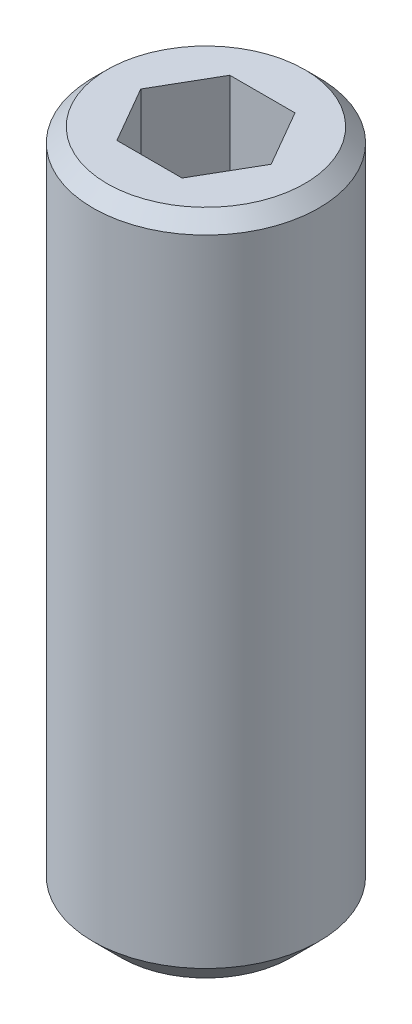
ISO-10303-21;
HEADER;
FILE_DESCRIPTION(('STEP AP214'),'2;1');
FILE_NAME('part.step','',(''),(''),'','','');
FILE_SCHEMA(('AUTOMOTIVE_DESIGN { 1 0 10303 214 1 1 1 1 }'));
ENDSEC;
DATA;
#1=APPLICATION_CONTEXT('core data for automotive mechanical design processes');
#2=APPLICATION_PROTOCOL_DEFINITION('international standard','automotive_design',2000,#1);
#3=PRODUCT_CONTEXT('',#1,'mechanical');
#4=PRODUCT('Part','Part','',(#3));
#5=PRODUCT_RELATED_PRODUCT_CATEGORY('part','',(#4));
#6=PRODUCT_DEFINITION_FORMATION('','',#4);
#7=PRODUCT_DEFINITION_CONTEXT('part definition',#1,'design');
#8=PRODUCT_DEFINITION('design','',#6,#7);
#9=PRODUCT_DEFINITION_SHAPE('','',#8);
#10=(LENGTH_UNIT() NAMED_UNIT(*) SI_UNIT(.MILLI.,.METRE.));
#11=(NAMED_UNIT(*) PLANE_ANGLE_UNIT() SI_UNIT($,.RADIAN.));
#12=(NAMED_UNIT(*) SI_UNIT($,.STERADIAN.) SOLID_ANGLE_UNIT());
#13=UNCERTAINTY_MEASURE_WITH_UNIT(LENGTH_MEASURE(1.E-05),#10,'distance_accuracy_value','');
#14=(GEOMETRIC_REPRESENTATION_CONTEXT(3) GLOBAL_UNCERTAINTY_ASSIGNED_CONTEXT((#13)) GLOBAL_UNIT_ASSIGNED_CONTEXT((#10,
#11,#12)) REPRESENTATION_CONTEXT('',''));
#15=CARTESIAN_POINT('',(0.,0.,0.));
#16=DIRECTION('',(0.,0.,1.));
#17=DIRECTION('',(1.,0.,0.));
#18=AXIS2_PLACEMENT_3D('',#15,#16,#17);
#19=CARTESIAN_POINT('',(0.,12.,0.));
#20=DIRECTION('',(0.,-1.,0.));
#21=DIRECTION('',(0.,0.,-1.));
#22=AXIS2_PLACEMENT_3D('',#19,#20,#21);
#23=CYLINDRICAL_SURFACE('',#22,2.);
#24=CARTESIAN_POINT('',(0.,0.500000000000002,0.));
#25=DIRECTION('',(0.,1.,0.));
#26=DIRECTION('',(0.,0.,1.));
#27=AXIS2_PLACEMENT_3D('',#24,#25,#26);
#28=CIRCLE('',#27,2.);
#29=CARTESIAN_POINT('',(0.,0.500000000000002,2.));
#30=VERTEX_POINT('',#29);
#31=EDGE_CURVE('E48',#30,#30,#28,.T.);
#32=ORIENTED_EDGE('',*,*,#31,.T.);
#33=EDGE_LOOP('',(#32));
#34=FACE_BOUND('',#33,.T.);
#35=CARTESIAN_POINT('',(0.,11.75,0.));
#36=DIRECTION('',(0.,1.,0.));
#37=DIRECTION('',(0.,0.,1.));
#38=AXIS2_PLACEMENT_3D('',#35,#36,#37);
#39=CIRCLE('',#38,2.);
#40=CARTESIAN_POINT('',(0.,11.75,2.));
#41=VERTEX_POINT('',#40);
#42=EDGE_CURVE('E150',#41,#41,#39,.F.);
#43=ORIENTED_EDGE('',*,*,#42,.T.);
#44=EDGE_LOOP('',(#43));
#45=FACE_BOUND('',#44,.T.);
#46=ADVANCED_FACE('F40',(#34,#45),#23,.T.);
#47=CARTESIAN_POINT('',(0.,12.,0.));
#48=DIRECTION('',(0.,1.,0.));
#49=DIRECTION('',(0.,0.,1.));
#50=AXIS2_PLACEMENT_3D('',#47,#48,#49);
#51=PLANE('',#50);
#52=DIRECTION('',(-0.5,0.,0.866025403784439));
#53=VECTOR('',#52,1.);
#54=CARTESIAN_POINT('',(-0.577350269189626,12.,-1.));
#55=LINE('',#54,#53);
#56=CARTESIAN_POINT('',(-0.577350269189626,12.,-1.));
#57=VERTEX_POINT('',#56);
#58=CARTESIAN_POINT('',(-1.15470053837925,12.,0.));
#59=VERTEX_POINT('',#58);
#60=EDGE_CURVE('E55',#57,#59,#55,.T.);
#61=ORIENTED_EDGE('',*,*,#60,.F.);
#62=DIRECTION('',(-1.,0.,0.));
#63=VECTOR('',#62,1.);
#64=CARTESIAN_POINT('',(0.577350269189625,12.,-1.));
#65=LINE('',#64,#63);
#66=CARTESIAN_POINT('',(0.577350269189625,12.,-1.));
#67=VERTEX_POINT('',#66);
#68=EDGE_CURVE('E138',#67,#57,#65,.T.);
#69=ORIENTED_EDGE('',*,*,#68,.F.);
#70=DIRECTION('',(-0.5,0.,-0.866025403784439));
#71=VECTOR('',#70,1.);
#72=CARTESIAN_POINT('',(1.15470053837925,12.,0.));
#73=LINE('',#72,#71);
#74=CARTESIAN_POINT('',(1.15470053837925,12.,0.));
#75=VERTEX_POINT('',#74);
#76=EDGE_CURVE('E136',#75,#67,#73,.T.);
#77=ORIENTED_EDGE('',*,*,#76,.F.);
#78=DIRECTION('',(0.5,0.,-0.866025403784439));
#79=VECTOR('',#78,1.);
#80=CARTESIAN_POINT('',(0.577350269189625,12.,1.));
#81=LINE('',#80,#79);
#82=CARTESIAN_POINT('',(0.577350269189625,12.,1.));
#83=VERTEX_POINT('',#82);
#84=EDGE_CURVE('E103',#83,#75,#81,.T.);
#85=ORIENTED_EDGE('',*,*,#84,.F.);
#86=DIRECTION('',(1.,0.,0.));
#87=VECTOR('',#86,1.);
#88=CARTESIAN_POINT('',(-0.577350269189626,12.,1.));
#89=LINE('',#88,#87);
#90=CARTESIAN_POINT('',(-0.577350269189626,12.,1.));
#91=VERTEX_POINT('',#90);
#92=EDGE_CURVE('E132',#91,#83,#89,.T.);
#93=ORIENTED_EDGE('',*,*,#92,.F.);
#94=DIRECTION('',(0.5,0.,0.866025403784439));
#95=VECTOR('',#94,1.);
#96=CARTESIAN_POINT('',(-1.15470053837925,12.,0.));
#97=LINE('',#96,#95);
#98=EDGE_CURVE('E129',#59,#91,#97,.T.);
#99=ORIENTED_EDGE('',*,*,#98,.F.);
#100=EDGE_LOOP('',(#61,#69,#77,#85,#93,#99));
#101=FACE_BOUND('',#100,.T.);
#102=CARTESIAN_POINT('',(0.,12.,0.));
#103=DIRECTION('',(0.,1.,0.));
#104=DIRECTION('',(0.,0.,1.));
#105=AXIS2_PLACEMENT_3D('',#102,#103,#104);
#106=CIRCLE('',#105,1.75);
#107=CARTESIAN_POINT('',(0.,12.,1.75));
#108=VERTEX_POINT('',#107);
#109=EDGE_CURVE('E142',#108,#108,#106,.T.);
#110=ORIENTED_EDGE('',*,*,#109,.T.);
#111=EDGE_LOOP('',(#110));
#112=FACE_BOUND('',#111,.T.);
#113=ADVANCED_FACE('F171',(#101,#112),#51,.T.);
#114=CARTESIAN_POINT('',(0.,0.,0.));
#115=DIRECTION('',(0.,1.,0.));
#116=DIRECTION('',(0.,0.,1.));
#117=AXIS2_PLACEMENT_3D('',#114,#115,#116);
#118=PLANE('',#117);
#119=CARTESIAN_POINT('',(0.,0.,0.));
#120=DIRECTION('',(0.,1.,0.));
#121=DIRECTION('',(0.,0.,1.));
#122=AXIS2_PLACEMENT_3D('',#119,#120,#121);
#123=CIRCLE('',#122,1.5);
#124=CARTESIAN_POINT('',(0.,0.,1.5));
#125=VERTEX_POINT('',#124);
#126=EDGE_CURVE('E11',#125,#125,#123,.F.);
#127=ORIENTED_EDGE('',*,*,#126,.T.);
#128=EDGE_LOOP('',(#127));
#129=FACE_BOUND('',#128,.T.);
#130=ADVANCED_FACE('F167',(#129),#118,.F.);
#131=CARTESIAN_POINT('',(0.,12.,0.));
#132=DIRECTION('',(0.,-1.,0.));
#133=DIRECTION('',(0.,0.,-1.));
#134=AXIS2_PLACEMENT_3D('',#131,#132,#133);
#135=CONICAL_SURFACE('',#134,1.75,0.785398163397448);
#136=ORIENTED_EDGE('',*,*,#42,.F.);
#137=EDGE_LOOP('',(#136));
#138=FACE_BOUND('',#137,.T.);
#139=ORIENTED_EDGE('',*,*,#109,.F.);
#140=EDGE_LOOP('',(#139));
#141=FACE_BOUND('',#140,.T.);
#142=ADVANCED_FACE('F159',(#138,#141),#135,.T.);
#143=CARTESIAN_POINT('',(0.,0.500000000000002,0.));
#144=DIRECTION('',(0.,1.,0.));
#145=DIRECTION('',(0.,0.,1.));
#146=AXIS2_PLACEMENT_3D('',#143,#144,#145);
#147=CONICAL_SURFACE('',#146,2.,0.78539816339745);
#148=ORIENTED_EDGE('',*,*,#126,.F.);
#149=EDGE_LOOP('',(#148));
#150=FACE_BOUND('',#149,.T.);
#151=ORIENTED_EDGE('',*,*,#31,.F.);
#152=EDGE_LOOP('',(#151));
#153=FACE_BOUND('',#152,.T.);
#154=ADVANCED_FACE('F42',(#150,#153),#147,.T.);
#155=CARTESIAN_POINT('',(-0.577350269189626,10.5,-1.));
#156=DIRECTION('',(-0.866025403784439,0.,-0.5));
#157=DIRECTION('',(-0.5,0.,0.866025403784439));
#158=AXIS2_PLACEMENT_3D('',#155,#156,#157);
#159=PLANE('',#158);
#160=ORIENTED_EDGE('',*,*,#60,.T.);
#161=DIRECTION('',(0.,1.,0.));
#162=VECTOR('',#161,1.);
#163=CARTESIAN_POINT('',(-1.15470053837925,10.5,0.));
#164=LINE('',#163,#162);
#165=CARTESIAN_POINT('',(-1.15470053837925,10.5,0.));
#166=VERTEX_POINT('',#165);
#167=EDGE_CURVE('E85',#166,#59,#164,.T.);
#168=ORIENTED_EDGE('',*,*,#167,.F.);
#169=DIRECTION('',(-0.5,0.,0.866025403784439));
#170=VECTOR('',#169,1.);
#171=CARTESIAN_POINT('',(-0.577350269189626,10.5,-1.));
#172=LINE('',#171,#170);
#173=CARTESIAN_POINT('',(-0.577350269189626,10.5,-1.));
#174=VERTEX_POINT('',#173);
#175=EDGE_CURVE('E140',#174,#166,#172,.T.);
#176=ORIENTED_EDGE('',*,*,#175,.F.);
#177=DIRECTION('',(0.,1.,0.));
#178=VECTOR('',#177,1.);
#179=CARTESIAN_POINT('',(-0.577350269189626,10.5,-1.));
#180=LINE('',#179,#178);
#181=EDGE_CURVE('E63',#174,#57,#180,.T.);
#182=ORIENTED_EDGE('',*,*,#181,.T.);
#183=EDGE_LOOP('',(#160,#168,#176,#182));
#184=FACE_BOUND('',#183,.T.);
#185=ADVANCED_FACE('F158',(#184),#159,.F.);
#186=CARTESIAN_POINT('',(0.577350269189625,10.5,-1.));
#187=DIRECTION('',(0.,0.,-1.));
#188=DIRECTION('',(-1.,0.,0.));
#189=AXIS2_PLACEMENT_3D('',#186,#187,#188);
#190=PLANE('',#189);
#191=ORIENTED_EDGE('',*,*,#68,.T.);
#192=ORIENTED_EDGE('',*,*,#181,.F.);
#193=DIRECTION('',(-1.,0.,0.));
#194=VECTOR('',#193,1.);
#195=CARTESIAN_POINT('',(0.577350269189625,10.5,-1.));
#196=LINE('',#195,#194);
#197=CARTESIAN_POINT('',(0.577350269189625,10.5,-1.));
#198=VERTEX_POINT('',#197);
#199=EDGE_CURVE('E115',#198,#174,#196,.T.);
#200=ORIENTED_EDGE('',*,*,#199,.F.);
#201=DIRECTION('',(0.,1.,0.));
#202=VECTOR('',#201,1.);
#203=CARTESIAN_POINT('',(0.577350269189625,10.5,-1.));
#204=LINE('',#203,#202);
#205=EDGE_CURVE('E107',#198,#67,#204,.T.);
#206=ORIENTED_EDGE('',*,*,#205,.T.);
#207=EDGE_LOOP('',(#191,#192,#200,#206));
#208=FACE_BOUND('',#207,.T.);
#209=ADVANCED_FACE('F165',(#208),#190,.F.);
#210=CARTESIAN_POINT('',(1.15470053837925,10.5,0.));
#211=DIRECTION('',(0.866025403784439,0.,-0.5));
#212=DIRECTION('',(-0.5,0.,-0.866025403784439));
#213=AXIS2_PLACEMENT_3D('',#210,#211,#212);
#214=PLANE('',#213);
#215=ORIENTED_EDGE('',*,*,#76,.T.);
#216=ORIENTED_EDGE('',*,*,#205,.F.);
#217=DIRECTION('',(-0.5,0.,-0.866025403784439));
#218=VECTOR('',#217,1.);
#219=CARTESIAN_POINT('',(1.15470053837925,10.5,0.));
#220=LINE('',#219,#218);
#221=CARTESIAN_POINT('',(1.15470053837925,10.5,0.));
#222=VERTEX_POINT('',#221);
#223=EDGE_CURVE('E111',#222,#198,#220,.T.);
#224=ORIENTED_EDGE('',*,*,#223,.F.);
#225=DIRECTION('',(0.,1.,0.));
#226=VECTOR('',#225,1.);
#227=CARTESIAN_POINT('',(1.15470053837925,10.5,0.));
#228=LINE('',#227,#226);
#229=EDGE_CURVE('E96',#222,#75,#228,.T.);
#230=ORIENTED_EDGE('',*,*,#229,.T.);
#231=EDGE_LOOP('',(#215,#216,#224,#230));
#232=FACE_BOUND('',#231,.T.);
#233=ADVANCED_FACE('F112',(#232),#214,.F.);
#234=CARTESIAN_POINT('',(0.577350269189625,10.5,1.));
#235=DIRECTION('',(0.866025403784439,0.,0.5));
#236=DIRECTION('',(0.5,0.,-0.866025403784439));
#237=AXIS2_PLACEMENT_3D('',#234,#235,#236);
#238=PLANE('',#237);
#239=ORIENTED_EDGE('',*,*,#84,.T.);
#240=ORIENTED_EDGE('',*,*,#229,.F.);
#241=DIRECTION('',(0.5,0.,-0.866025403784439));
#242=VECTOR('',#241,1.);
#243=CARTESIAN_POINT('',(0.577350269189625,10.5,1.));
#244=LINE('',#243,#242);
#245=CARTESIAN_POINT('',(0.577350269189625,10.5,1.));
#246=VERTEX_POINT('',#245);
#247=EDGE_CURVE('E100',#246,#222,#244,.T.);
#248=ORIENTED_EDGE('',*,*,#247,.F.);
#249=DIRECTION('',(0.,1.,0.));
#250=VECTOR('',#249,1.);
#251=CARTESIAN_POINT('',(0.577350269189625,10.5,1.));
#252=LINE('',#251,#250);
#253=EDGE_CURVE('E108',#246,#83,#252,.T.);
#254=ORIENTED_EDGE('',*,*,#253,.T.);
#255=EDGE_LOOP('',(#239,#240,#248,#254));
#256=FACE_BOUND('',#255,.T.);
#257=ADVANCED_FACE('F98',(#256),#238,.F.);
#258=CARTESIAN_POINT('',(-0.577350269189626,10.5,1.));
#259=DIRECTION('',(0.,0.,1.));
#260=DIRECTION('',(1.,0.,0.));
#261=AXIS2_PLACEMENT_3D('',#258,#259,#260);
#262=PLANE('',#261);
#263=ORIENTED_EDGE('',*,*,#92,.T.);
#264=ORIENTED_EDGE('',*,*,#253,.F.);
#265=DIRECTION('',(1.,0.,0.));
#266=VECTOR('',#265,1.);
#267=CARTESIAN_POINT('',(-0.577350269189626,10.5,1.));
#268=LINE('',#267,#266);
#269=CARTESIAN_POINT('',(-0.577350269189626,10.5,1.));
#270=VERTEX_POINT('',#269);
#271=EDGE_CURVE('E121',#270,#246,#268,.T.);
#272=ORIENTED_EDGE('',*,*,#271,.F.);
#273=DIRECTION('',(0.,1.,0.));
#274=VECTOR('',#273,1.);
#275=CARTESIAN_POINT('',(-0.577350269189626,10.5,1.));
#276=LINE('',#275,#274);
#277=EDGE_CURVE('E145',#270,#91,#276,.T.);
#278=ORIENTED_EDGE('',*,*,#277,.T.);
#279=EDGE_LOOP('',(#263,#264,#272,#278));
#280=FACE_BOUND('',#279,.T.);
#281=ADVANCED_FACE('F185',(#280),#262,.F.);
#282=CARTESIAN_POINT('',(-1.15470053837925,10.5,0.));
#283=DIRECTION('',(-0.866025403784439,0.,0.5));
#284=DIRECTION('',(0.5,0.,0.866025403784439));
#285=AXIS2_PLACEMENT_3D('',#282,#283,#284);
#286=PLANE('',#285);
#287=ORIENTED_EDGE('',*,*,#98,.T.);
#288=ORIENTED_EDGE('',*,*,#277,.F.);
#289=DIRECTION('',(0.5,0.,0.866025403784439));
#290=VECTOR('',#289,1.);
#291=CARTESIAN_POINT('',(-1.15470053837925,10.5,0.));
#292=LINE('',#291,#290);
#293=EDGE_CURVE('E123',#166,#270,#292,.T.);
#294=ORIENTED_EDGE('',*,*,#293,.F.);
#295=ORIENTED_EDGE('',*,*,#167,.T.);
#296=EDGE_LOOP('',(#287,#288,#294,#295));
#297=FACE_BOUND('',#296,.T.);
#298=ADVANCED_FACE('F182',(#297),#286,.F.);
#299=CARTESIAN_POINT('',(-1.15470053837925,10.5,0.));
#300=DIRECTION('',(0.,1.,0.));
#301=DIRECTION('',(0.,0.,1.));
#302=AXIS2_PLACEMENT_3D('',#299,#300,#301);
#303=PLANE('',#302);
#304=ORIENTED_EDGE('',*,*,#175,.T.);
#305=ORIENTED_EDGE('',*,*,#293,.T.);
#306=ORIENTED_EDGE('',*,*,#271,.T.);
#307=ORIENTED_EDGE('',*,*,#247,.T.);
#308=ORIENTED_EDGE('',*,*,#223,.T.);
#309=ORIENTED_EDGE('',*,*,#199,.T.);
#310=EDGE_LOOP('',(#304,#305,#306,#307,#308,#309));
#311=FACE_BOUND('',#310,.T.);
#312=ADVANCED_FACE('F118',(#311),#303,.T.);
#313=CLOSED_SHELL('',(#46,#113,#130,#142,#154,#185,#209,#233,#257,#281,#298,#312));
#314=MANIFOLD_SOLID_BREP('B2',#313);
#315=ADVANCED_BREP_SHAPE_REPRESENTATION('',(#18,#314),#14);
#316=SHAPE_DEFINITION_REPRESENTATION(#9,#315);
ENDSEC;
END-ISO-10303-21;
